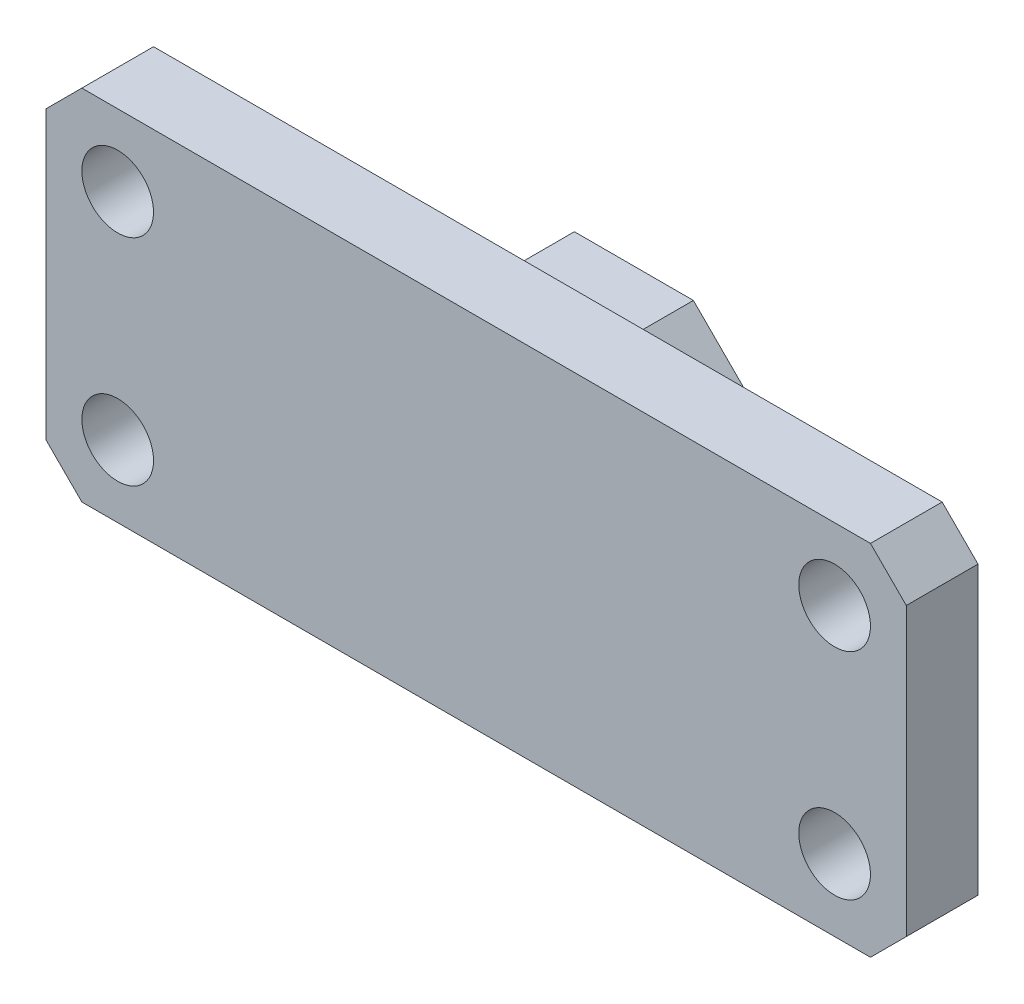
ISO-10303-21;
HEADER;
FILE_DESCRIPTION(('STEP AP214'),'2;1');
FILE_NAME('part.step','',(''),(''),'','','');
FILE_SCHEMA(('AUTOMOTIVE_DESIGN { 1 0 10303 214 1 1 1 1 }'));
ENDSEC;
DATA;
#1=APPLICATION_CONTEXT('core data for automotive mechanical design processes');
#2=APPLICATION_PROTOCOL_DEFINITION('international standard','automotive_design',2000,#1);
#3=PRODUCT_CONTEXT('',#1,'mechanical');
#4=PRODUCT('Part','Part','',(#3));
#5=PRODUCT_RELATED_PRODUCT_CATEGORY('part','',(#4));
#6=PRODUCT_DEFINITION_FORMATION('','',#4);
#7=PRODUCT_DEFINITION_CONTEXT('part definition',#1,'design');
#8=PRODUCT_DEFINITION('design','',#6,#7);
#9=PRODUCT_DEFINITION_SHAPE('','',#8);
#10=(LENGTH_UNIT() NAMED_UNIT(*) SI_UNIT(.MILLI.,.METRE.));
#11=(NAMED_UNIT(*) PLANE_ANGLE_UNIT() SI_UNIT($,.RADIAN.));
#12=(NAMED_UNIT(*) SI_UNIT($,.STERADIAN.) SOLID_ANGLE_UNIT());
#13=UNCERTAINTY_MEASURE_WITH_UNIT(LENGTH_MEASURE(1.E-05),#10,'distance_accuracy_value','');
#14=(GEOMETRIC_REPRESENTATION_CONTEXT(3) GLOBAL_UNCERTAINTY_ASSIGNED_CONTEXT((#13)) GLOBAL_UNIT_ASSIGNED_CONTEXT((#10,
#11,#12)) REPRESENTATION_CONTEXT('',''));
#15=CARTESIAN_POINT('',(0.,0.,0.));
#16=DIRECTION('',(0.,0.,1.));
#17=DIRECTION('',(1.,0.,0.));
#18=AXIS2_PLACEMENT_3D('',#15,#16,#17);
#19=CARTESIAN_POINT('',(0.,0.,10.));
#20=DIRECTION('',(0.,0.,1.));
#21=DIRECTION('',(1.,0.,0.));
#22=AXIS2_PLACEMENT_3D('',#19,#20,#21);
#23=PLANE('',#22);
#24=CARTESIAN_POINT('',(-50.,15.,10.));
#25=DIRECTION('',(0.,0.,-1.));
#26=DIRECTION('',(-1.,0.,0.));
#27=AXIS2_PLACEMENT_3D('',#24,#25,#26);
#28=CIRCLE('',#27,5.);
#29=CARTESIAN_POINT('',(-55.,15.,10.));
#30=VERTEX_POINT('',#29);
#31=EDGE_CURVE('E255',#30,#30,#28,.T.);
#32=ORIENTED_EDGE('',*,*,#31,.T.);
#33=EDGE_LOOP('',(#32));
#34=FACE_BOUND('',#33,.T.);
#35=CARTESIAN_POINT('',(50.,15.,10.));
#36=DIRECTION('',(0.,0.,1.));
#37=DIRECTION('',(1.,0.,0.));
#38=AXIS2_PLACEMENT_3D('',#35,#36,#37);
#39=CIRCLE('',#38,5.);
#40=CARTESIAN_POINT('',(55.,15.,10.));
#41=VERTEX_POINT('',#40);
#42=EDGE_CURVE('E258',#41,#41,#39,.T.);
#43=ORIENTED_EDGE('',*,*,#42,.F.);
#44=EDGE_LOOP('',(#43));
#45=FACE_BOUND('',#44,.T.);
#46=DIRECTION('',(1.,0.,0.));
#47=VECTOR('',#46,1.);
#48=CARTESIAN_POINT('',(-60.,25.,10.));
#49=LINE('',#48,#47);
#50=CARTESIAN_POINT('',(-55.,25.,10.));
#51=VERTEX_POINT('',#50);
#52=CARTESIAN_POINT('',(55.,25.,10.));
#53=VERTEX_POINT('',#52);
#54=EDGE_CURVE('E287',#51,#53,#49,.T.);
#55=ORIENTED_EDGE('',*,*,#54,.F.);
#56=DIRECTION('',(-0.707106781186549,-0.707106781186547,0.));
#57=VECTOR('',#56,1.);
#58=CARTESIAN_POINT('',(-39.9999999999999,40.,10.));
#59=LINE('',#58,#57);
#60=CARTESIAN_POINT('',(-60.,20.,10.));
#61=VERTEX_POINT('',#60);
#62=EDGE_CURVE('E323',#51,#61,#59,.T.);
#63=ORIENTED_EDGE('',*,*,#62,.T.);
#64=DIRECTION('',(0.,-1.,0.));
#65=VECTOR('',#64,1.);
#66=CARTESIAN_POINT('',(-60.,25.,10.));
#67=LINE('',#66,#65);
#68=CARTESIAN_POINT('',(-60.,-20.,10.));
#69=VERTEX_POINT('',#68);
#70=EDGE_CURVE('E279',#61,#69,#67,.T.);
#71=ORIENTED_EDGE('',*,*,#70,.T.);
#72=DIRECTION('',(-0.707106781186547,0.707106781186549,0.));
#73=VECTOR('',#72,1.);
#74=CARTESIAN_POINT('',(-40.0000000000001,-40.,10.));
#75=LINE('',#74,#73);
#76=CARTESIAN_POINT('',(-55.,-25.,10.));
#77=VERTEX_POINT('',#76);
#78=EDGE_CURVE('E321',#69,#77,#75,.F.);
#79=ORIENTED_EDGE('',*,*,#78,.T.);
#80=DIRECTION('',(1.,0.,0.));
#81=VECTOR('',#80,1.);
#82=CARTESIAN_POINT('',(-60.,-25.,10.));
#83=LINE('',#82,#81);
#84=CARTESIAN_POINT('',(55.,-25.,10.));
#85=VERTEX_POINT('',#84);
#86=EDGE_CURVE('E282',#77,#85,#83,.T.);
#87=ORIENTED_EDGE('',*,*,#86,.T.);
#88=DIRECTION('',(0.707106781186549,0.707106781186547,0.));
#89=VECTOR('',#88,1.);
#90=CARTESIAN_POINT('',(39.9999999999999,-40.,10.));
#91=LINE('',#90,#89);
#92=CARTESIAN_POINT('',(60.,-20.,10.));
#93=VERTEX_POINT('',#92);
#94=EDGE_CURVE('E65',#85,#93,#91,.T.);
#95=ORIENTED_EDGE('',*,*,#94,.T.);
#96=DIRECTION('',(0.,-1.,0.));
#97=VECTOR('',#96,1.);
#98=CARTESIAN_POINT('',(60.,25.,10.));
#99=LINE('',#98,#97);
#100=CARTESIAN_POINT('',(60.,20.,10.));
#101=VERTEX_POINT('',#100);
#102=EDGE_CURVE('E285',#101,#93,#99,.T.);
#103=ORIENTED_EDGE('',*,*,#102,.F.);
#104=DIRECTION('',(0.707106781186547,-0.707106781186549,0.));
#105=VECTOR('',#104,1.);
#106=CARTESIAN_POINT('',(40.0000000000001,40.,10.));
#107=LINE('',#106,#105);
#108=EDGE_CURVE('E318',#101,#53,#107,.F.);
#109=ORIENTED_EDGE('',*,*,#108,.T.);
#110=EDGE_LOOP('',(#55,#63,#71,#79,#87,#95,#103,#109));
#111=FACE_BOUND('',#110,.T.);
#112=CARTESIAN_POINT('',(-50.,-15.,10.));
#113=DIRECTION('',(0.,0.,1.));
#114=DIRECTION('',(1.,0.,0.));
#115=AXIS2_PLACEMENT_3D('',#112,#113,#114);
#116=CIRCLE('',#115,5.);
#117=CARTESIAN_POINT('',(-45.,-15.,10.));
#118=VERTEX_POINT('',#117);
#119=EDGE_CURVE('E262',#118,#118,#116,.T.);
#120=ORIENTED_EDGE('',*,*,#119,.F.);
#121=EDGE_LOOP('',(#120));
#122=FACE_BOUND('',#121,.T.);
#123=CARTESIAN_POINT('',(50.,-15.,10.));
#124=DIRECTION('',(0.,0.,-1.));
#125=DIRECTION('',(-1.,0.,0.));
#126=AXIS2_PLACEMENT_3D('',#123,#124,#125);
#127=CIRCLE('',#126,5.);
#128=CARTESIAN_POINT('',(45.,-15.,10.));
#129=VERTEX_POINT('',#128);
#130=EDGE_CURVE('E268',#129,#129,#127,.T.);
#131=ORIENTED_EDGE('',*,*,#130,.T.);
#132=EDGE_LOOP('',(#131));
#133=FACE_BOUND('',#132,.T.);
#134=ADVANCED_FACE('F41',(#34,#45,#111,#122,#133),#23,.T.);
#135=CARTESIAN_POINT('',(0.,0.,0.));
#136=DIRECTION('',(0.,0.,1.));
#137=DIRECTION('',(1.,0.,0.));
#138=AXIS2_PLACEMENT_3D('',#135,#136,#137);
#139=PLANE('',#138);
#140=DIRECTION('',(0.,1.,0.));
#141=VECTOR('',#140,1.);
#142=CARTESIAN_POINT('',(35.,0.,0.));
#143=LINE('',#142,#141);
#144=CARTESIAN_POINT('',(35.,-8.29999999999997,0.));
#145=VERTEX_POINT('',#144);
#146=CARTESIAN_POINT('',(35.,8.3,0.));
#147=VERTEX_POINT('',#146);
#148=EDGE_CURVE('E50',#145,#147,#143,.T.);
#149=ORIENTED_EDGE('',*,*,#148,.T.);
#150=DIRECTION('',(-1.,0.,0.));
#151=VECTOR('',#150,1.);
#152=CARTESIAN_POINT('',(0.,8.3,0.));
#153=LINE('',#152,#151);
#154=CARTESIAN_POINT('',(20.,8.3,0.));
#155=VERTEX_POINT('',#154);
#156=EDGE_CURVE('E11',#147,#155,#153,.T.);
#157=ORIENTED_EDGE('',*,*,#156,.T.);
#158=DIRECTION('',(-0.707106781186548,0.707106781186548,0.));
#159=VECTOR('',#158,1.);
#160=CARTESIAN_POINT('',(14.15,14.15,0.));
#161=LINE('',#160,#159);
#162=CARTESIAN_POINT('',(8.3,20.,0.));
#163=VERTEX_POINT('',#162);
#164=EDGE_CURVE('E185',#155,#163,#161,.T.);
#165=ORIENTED_EDGE('',*,*,#164,.T.);
#166=DIRECTION('',(1.,0.,0.));
#167=VECTOR('',#166,1.);
#168=CARTESIAN_POINT('',(0.,20.,0.));
#169=LINE('',#168,#167);
#170=CARTESIAN_POINT('',(-8.3,20.,0.));
#171=VERTEX_POINT('',#170);
#172=EDGE_CURVE('E336',#171,#163,#169,.T.);
#173=ORIENTED_EDGE('',*,*,#172,.F.);
#174=DIRECTION('',(0.707106781186548,0.707106781186548,0.));
#175=VECTOR('',#174,1.);
#176=CARTESIAN_POINT('',(-14.15,14.15,0.));
#177=LINE('',#176,#175);
#178=CARTESIAN_POINT('',(-20.,8.3,0.));
#179=VERTEX_POINT('',#178);
#180=EDGE_CURVE('E338',#179,#171,#177,.T.);
#181=ORIENTED_EDGE('',*,*,#180,.F.);
#182=DIRECTION('',(1.,0.,0.));
#183=VECTOR('',#182,1.);
#184=CARTESIAN_POINT('',(0.,8.3,0.));
#185=LINE('',#184,#183);
#186=CARTESIAN_POINT('',(-35.,8.3,0.));
#187=VERTEX_POINT('',#186);
#188=EDGE_CURVE('E340',#187,#179,#185,.T.);
#189=ORIENTED_EDGE('',*,*,#188,.F.);
#190=DIRECTION('',(0.,1.,0.));
#191=VECTOR('',#190,1.);
#192=CARTESIAN_POINT('',(-35.,0.,0.));
#193=LINE('',#192,#191);
#194=CARTESIAN_POINT('',(-35.,-8.29999999999999,0.));
#195=VERTEX_POINT('',#194);
#196=EDGE_CURVE('E342',#195,#187,#193,.T.);
#197=ORIENTED_EDGE('',*,*,#196,.F.);
#198=DIRECTION('',(1.,0.,0.));
#199=VECTOR('',#198,1.);
#200=CARTESIAN_POINT('',(0.,-8.29999999999998,0.));
#201=LINE('',#200,#199);
#202=CARTESIAN_POINT('',(-20.,-8.29999999999999,0.));
#203=VERTEX_POINT('',#202);
#204=EDGE_CURVE('E344',#195,#203,#201,.T.);
#205=ORIENTED_EDGE('',*,*,#204,.T.);
#206=DIRECTION('',(0.707106781186548,-0.707106781186547,0.));
#207=VECTOR('',#206,1.);
#208=CARTESIAN_POINT('',(-14.15,-14.15,0.));
#209=LINE('',#208,#207);
#210=CARTESIAN_POINT('',(-8.3,-20.,0.));
#211=VERTEX_POINT('',#210);
#212=EDGE_CURVE('E347',#203,#211,#209,.T.);
#213=ORIENTED_EDGE('',*,*,#212,.T.);
#214=DIRECTION('',(1.,0.,0.));
#215=VECTOR('',#214,1.);
#216=CARTESIAN_POINT('',(0.,-20.,0.));
#217=LINE('',#216,#215);
#218=CARTESIAN_POINT('',(8.3,-20.,0.));
#219=VERTEX_POINT('',#218);
#220=EDGE_CURVE('E350',#211,#219,#217,.T.);
#221=ORIENTED_EDGE('',*,*,#220,.T.);
#222=DIRECTION('',(-0.707106781186547,-0.707106781186548,0.));
#223=VECTOR('',#222,1.);
#224=CARTESIAN_POINT('',(14.15,-14.15,0.));
#225=LINE('',#224,#223);
#226=CARTESIAN_POINT('',(20.,-8.29999999999998,0.));
#227=VERTEX_POINT('',#226);
#228=EDGE_CURVE('E353',#227,#219,#225,.T.);
#229=ORIENTED_EDGE('',*,*,#228,.F.);
#230=DIRECTION('',(-1.,0.,0.));
#231=VECTOR('',#230,1.);
#232=CARTESIAN_POINT('',(0.,-8.29999999999998,0.));
#233=LINE('',#232,#231);
#234=EDGE_CURVE('E355',#145,#227,#233,.T.);
#235=ORIENTED_EDGE('',*,*,#234,.F.);
#236=EDGE_LOOP('',(#149,#157,#165,#173,#181,#189,#197,#205,#213,#221,#229,#235));
#237=FACE_BOUND('',#236,.T.);
#238=CARTESIAN_POINT('',(-50.,-15.,0.));
#239=DIRECTION('',(0.,0.,1.));
#240=DIRECTION('',(1.,0.,0.));
#241=AXIS2_PLACEMENT_3D('',#238,#239,#240);
#242=CIRCLE('',#241,5.);
#243=CARTESIAN_POINT('',(-45.,-15.,0.));
#244=VERTEX_POINT('',#243);
#245=EDGE_CURVE('E265',#244,#244,#242,.T.);
#246=ORIENTED_EDGE('',*,*,#245,.T.);
#247=EDGE_LOOP('',(#246));
#248=FACE_BOUND('',#247,.T.);
#249=CARTESIAN_POINT('',(50.,15.,0.));
#250=DIRECTION('',(0.,0.,1.));
#251=DIRECTION('',(1.,0.,0.));
#252=AXIS2_PLACEMENT_3D('',#249,#250,#251);
#253=CIRCLE('',#252,5.);
#254=CARTESIAN_POINT('',(55.,15.,0.));
#255=VERTEX_POINT('',#254);
#256=EDGE_CURVE('E273',#255,#255,#253,.T.);
#257=ORIENTED_EDGE('',*,*,#256,.T.);
#258=EDGE_LOOP('',(#257));
#259=FACE_BOUND('',#258,.T.);
#260=DIRECTION('',(0.,-1.,0.));
#261=VECTOR('',#260,1.);
#262=CARTESIAN_POINT('',(-60.,25.,0.));
#263=LINE('',#262,#261);
#264=CARTESIAN_POINT('',(-60.,20.,0.));
#265=VERTEX_POINT('',#264);
#266=CARTESIAN_POINT('',(-60.,-20.,0.));
#267=VERTEX_POINT('',#266);
#268=EDGE_CURVE('E276',#265,#267,#263,.T.);
#269=ORIENTED_EDGE('',*,*,#268,.F.);
#270=DIRECTION('',(0.707106781186549,0.707106781186547,0.));
#271=VECTOR('',#270,1.);
#272=CARTESIAN_POINT('',(-60.,20.,0.));
#273=LINE('',#272,#271);
#274=CARTESIAN_POINT('',(-55.,25.,0.));
#275=VERTEX_POINT('',#274);
#276=EDGE_CURVE('E311',#265,#275,#273,.T.);
#277=ORIENTED_EDGE('',*,*,#276,.T.);
#278=DIRECTION('',(1.,0.,0.));
#279=VECTOR('',#278,1.);
#280=CARTESIAN_POINT('',(-60.,25.,0.));
#281=LINE('',#280,#279);
#282=CARTESIAN_POINT('',(55.,25.,0.));
#283=VERTEX_POINT('',#282);
#284=EDGE_CURVE('E283',#275,#283,#281,.T.);
#285=ORIENTED_EDGE('',*,*,#284,.T.);
#286=DIRECTION('',(-0.707106781186547,0.707106781186549,0.));
#287=VECTOR('',#286,1.);
#288=CARTESIAN_POINT('',(55.,25.,0.));
#289=LINE('',#288,#287);
#290=CARTESIAN_POINT('',(60.,20.,0.));
#291=VERTEX_POINT('',#290);
#292=EDGE_CURVE('E305',#283,#291,#289,.F.);
#293=ORIENTED_EDGE('',*,*,#292,.T.);
#294=DIRECTION('',(0.,-1.,0.));
#295=VECTOR('',#294,1.);
#296=CARTESIAN_POINT('',(60.,25.,0.));
#297=LINE('',#296,#295);
#298=CARTESIAN_POINT('',(60.,-20.,0.));
#299=VERTEX_POINT('',#298);
#300=EDGE_CURVE('E296',#291,#299,#297,.T.);
#301=ORIENTED_EDGE('',*,*,#300,.T.);
#302=DIRECTION('',(-0.707106781186549,-0.707106781186547,0.));
#303=VECTOR('',#302,1.);
#304=CARTESIAN_POINT('',(60.,-20.,0.));
#305=LINE('',#304,#303);
#306=CARTESIAN_POINT('',(55.,-25.,0.));
#307=VERTEX_POINT('',#306);
#308=EDGE_CURVE('E307',#299,#307,#305,.T.);
#309=ORIENTED_EDGE('',*,*,#308,.T.);
#310=DIRECTION('',(1.,0.,0.));
#311=VECTOR('',#310,1.);
#312=CARTESIAN_POINT('',(-60.,-25.,0.));
#313=LINE('',#312,#311);
#314=CARTESIAN_POINT('',(-55.,-25.,0.));
#315=VERTEX_POINT('',#314);
#316=EDGE_CURVE('E293',#315,#307,#313,.T.);
#317=ORIENTED_EDGE('',*,*,#316,.F.);
#318=DIRECTION('',(0.707106781186547,-0.707106781186549,0.));
#319=VECTOR('',#318,1.);
#320=CARTESIAN_POINT('',(-55.,-25.,0.));
#321=LINE('',#320,#319);
#322=EDGE_CURVE('E309',#315,#267,#321,.F.);
#323=ORIENTED_EDGE('',*,*,#322,.T.);
#324=EDGE_LOOP('',(#269,#277,#285,#293,#301,#309,#317,#323));
#325=FACE_BOUND('',#324,.T.);
#326=CARTESIAN_POINT('',(-50.,15.,0.));
#327=DIRECTION('',(0.,0.,-1.));
#328=DIRECTION('',(-1.,0.,0.));
#329=AXIS2_PLACEMENT_3D('',#326,#327,#328);
#330=CIRCLE('',#329,5.);
#331=CARTESIAN_POINT('',(-55.,15.,0.));
#332=VERTEX_POINT('',#331);
#333=EDGE_CURVE('E259',#332,#332,#330,.T.);
#334=ORIENTED_EDGE('',*,*,#333,.F.);
#335=EDGE_LOOP('',(#334));
#336=FACE_BOUND('',#335,.T.);
#337=CARTESIAN_POINT('',(50.,-15.,0.));
#338=DIRECTION('',(0.,0.,-1.));
#339=DIRECTION('',(-1.,0.,0.));
#340=AXIS2_PLACEMENT_3D('',#337,#338,#339);
#341=CIRCLE('',#340,5.);
#342=CARTESIAN_POINT('',(45.,-15.,0.));
#343=VERTEX_POINT('',#342);
#344=EDGE_CURVE('E226',#343,#343,#341,.T.);
#345=ORIENTED_EDGE('',*,*,#344,.F.);
#346=EDGE_LOOP('',(#345));
#347=FACE_BOUND('',#346,.T.);
#348=ADVANCED_FACE('F359',(#237,#248,#259,#325,#336,#347),#139,.F.);
#349=CARTESIAN_POINT('',(-60.,25.,10.));
#350=DIRECTION('',(1.,0.,0.));
#351=DIRECTION('',(0.,0.,-1.));
#352=AXIS2_PLACEMENT_3D('',#349,#350,#351);
#353=PLANE('',#352);
#354=ORIENTED_EDGE('',*,*,#70,.F.);
#355=DIRECTION('',(0.,0.,-1.));
#356=VECTOR('',#355,1.);
#357=CARTESIAN_POINT('',(-60.,20.,0.));
#358=LINE('',#357,#356);
#359=EDGE_CURVE('E302',#61,#265,#358,.T.);
#360=ORIENTED_EDGE('',*,*,#359,.T.);
#361=ORIENTED_EDGE('',*,*,#268,.T.);
#362=DIRECTION('',(0.,0.,1.));
#363=VECTOR('',#362,1.);
#364=CARTESIAN_POINT('',(-60.,-20.,10.));
#365=LINE('',#364,#363);
#366=EDGE_CURVE('E290',#267,#69,#365,.T.);
#367=ORIENTED_EDGE('',*,*,#366,.T.);
#368=EDGE_LOOP('',(#354,#360,#361,#367));
#369=FACE_BOUND('',#368,.T.);
#370=ADVANCED_FACE('F413',(#369),#353,.F.);
#371=CARTESIAN_POINT('',(-60.,-25.,10.));
#372=DIRECTION('',(0.,1.,0.));
#373=DIRECTION('',(0.,0.,1.));
#374=AXIS2_PLACEMENT_3D('',#371,#372,#373);
#375=PLANE('',#374);
#376=ORIENTED_EDGE('',*,*,#86,.F.);
#377=DIRECTION('',(0.,0.,-1.));
#378=VECTOR('',#377,1.);
#379=CARTESIAN_POINT('',(-55.,-25.,10.));
#380=LINE('',#379,#378);
#381=EDGE_CURVE('E327',#77,#315,#380,.T.);
#382=ORIENTED_EDGE('',*,*,#381,.T.);
#383=ORIENTED_EDGE('',*,*,#316,.T.);
#384=DIRECTION('',(0.,0.,1.));
#385=VECTOR('',#384,1.);
#386=CARTESIAN_POINT('',(55.,-25.,10.));
#387=LINE('',#386,#385);
#388=EDGE_CURVE('E325',#307,#85,#387,.T.);
#389=ORIENTED_EDGE('',*,*,#388,.T.);
#390=EDGE_LOOP('',(#376,#382,#383,#389));
#391=FACE_BOUND('',#390,.T.);
#392=ADVANCED_FACE('F427',(#391),#375,.F.);
#393=CARTESIAN_POINT('',(60.,25.,10.));
#394=DIRECTION('',(1.,0.,0.));
#395=DIRECTION('',(0.,0.,-1.));
#396=AXIS2_PLACEMENT_3D('',#393,#394,#395);
#397=PLANE('',#396);
#398=ORIENTED_EDGE('',*,*,#102,.T.);
#399=DIRECTION('',(0.,0.,-1.));
#400=VECTOR('',#399,1.);
#401=CARTESIAN_POINT('',(60.,-20.,0.));
#402=LINE('',#401,#400);
#403=EDGE_CURVE('E332',#93,#299,#402,.T.);
#404=ORIENTED_EDGE('',*,*,#403,.T.);
#405=ORIENTED_EDGE('',*,*,#300,.F.);
#406=DIRECTION('',(0.,0.,1.));
#407=VECTOR('',#406,1.);
#408=CARTESIAN_POINT('',(60.,20.,10.));
#409=LINE('',#408,#407);
#410=EDGE_CURVE('E330',#291,#101,#409,.T.);
#411=ORIENTED_EDGE('',*,*,#410,.T.);
#412=EDGE_LOOP('',(#398,#404,#405,#411));
#413=FACE_BOUND('',#412,.T.);
#414=ADVANCED_FACE('F423',(#413),#397,.T.);
#415=CARTESIAN_POINT('',(-60.,25.,10.));
#416=DIRECTION('',(0.,1.,0.));
#417=DIRECTION('',(0.,0.,1.));
#418=AXIS2_PLACEMENT_3D('',#415,#416,#417);
#419=PLANE('',#418);
#420=ORIENTED_EDGE('',*,*,#284,.F.);
#421=DIRECTION('',(0.,0.,1.));
#422=VECTOR('',#421,1.);
#423=CARTESIAN_POINT('',(-55.,25.,10.));
#424=LINE('',#423,#422);
#425=EDGE_CURVE('E316',#275,#51,#424,.T.);
#426=ORIENTED_EDGE('',*,*,#425,.T.);
#427=ORIENTED_EDGE('',*,*,#54,.T.);
#428=DIRECTION('',(0.,0.,-1.));
#429=VECTOR('',#428,1.);
#430=CARTESIAN_POINT('',(55.,25.,10.));
#431=LINE('',#430,#429);
#432=EDGE_CURVE('E313',#53,#283,#431,.T.);
#433=ORIENTED_EDGE('',*,*,#432,.T.);
#434=EDGE_LOOP('',(#420,#426,#427,#433));
#435=FACE_BOUND('',#434,.T.);
#436=ADVANCED_FACE('F420',(#435),#419,.T.);
#437=CARTESIAN_POINT('',(50.,15.,0.));
#438=DIRECTION('',(0.,0.,1.));
#439=DIRECTION('',(1.,0.,0.));
#440=AXIS2_PLACEMENT_3D('',#437,#438,#439);
#441=CYLINDRICAL_SURFACE('',#440,5.);
#442=ORIENTED_EDGE('',*,*,#256,.F.);
#443=EDGE_LOOP('',(#442));
#444=FACE_BOUND('',#443,.T.);
#445=ORIENTED_EDGE('',*,*,#42,.T.);
#446=EDGE_LOOP('',(#445));
#447=FACE_BOUND('',#446,.T.);
#448=ADVANCED_FACE('F417',(#444,#447),#441,.F.);
#449=CARTESIAN_POINT('',(-50.,15.,0.));
#450=DIRECTION('',(0.,0.,1.));
#451=DIRECTION('',(1.,0.,0.));
#452=AXIS2_PLACEMENT_3D('',#449,#450,#451);
#453=CYLINDRICAL_SURFACE('',#452,5.);
#454=ORIENTED_EDGE('',*,*,#333,.T.);
#455=EDGE_LOOP('',(#454));
#456=FACE_BOUND('',#455,.T.);
#457=ORIENTED_EDGE('',*,*,#31,.F.);
#458=EDGE_LOOP('',(#457));
#459=FACE_BOUND('',#458,.T.);
#460=ADVANCED_FACE('F490',(#456,#459),#453,.F.);
#461=CARTESIAN_POINT('',(-50.,-15.,0.));
#462=DIRECTION('',(0.,0.,1.));
#463=DIRECTION('',(1.,0.,0.));
#464=AXIS2_PLACEMENT_3D('',#461,#462,#463);
#465=CYLINDRICAL_SURFACE('',#464,5.);
#466=ORIENTED_EDGE('',*,*,#245,.F.);
#467=EDGE_LOOP('',(#466));
#468=FACE_BOUND('',#467,.T.);
#469=ORIENTED_EDGE('',*,*,#119,.T.);
#470=EDGE_LOOP('',(#469));
#471=FACE_BOUND('',#470,.T.);
#472=ADVANCED_FACE('F485',(#468,#471),#465,.F.);
#473=CARTESIAN_POINT('',(50.,-15.,0.));
#474=DIRECTION('',(0.,0.,1.));
#475=DIRECTION('',(1.,0.,0.));
#476=AXIS2_PLACEMENT_3D('',#473,#474,#475);
#477=CYLINDRICAL_SURFACE('',#476,5.);
#478=ORIENTED_EDGE('',*,*,#344,.T.);
#479=EDGE_LOOP('',(#478));
#480=FACE_BOUND('',#479,.T.);
#481=ORIENTED_EDGE('',*,*,#130,.F.);
#482=EDGE_LOOP('',(#481));
#483=FACE_BOUND('',#482,.T.);
#484=ADVANCED_FACE('F443',(#480,#483),#477,.F.);
#485=CARTESIAN_POINT('',(-60.,20.,10.));
#486=DIRECTION('',(-0.707106781186546,0.707106781186548,0.));
#487=DIRECTION('',(0.,0.,1.));
#488=AXIS2_PLACEMENT_3D('',#485,#486,#487);
#489=PLANE('',#488);
#490=ORIENTED_EDGE('',*,*,#62,.F.);
#491=ORIENTED_EDGE('',*,*,#425,.F.);
#492=ORIENTED_EDGE('',*,*,#276,.F.);
#493=ORIENTED_EDGE('',*,*,#359,.F.);
#494=EDGE_LOOP('',(#490,#491,#492,#493));
#495=FACE_BOUND('',#494,.T.);
#496=ADVANCED_FACE('F436',(#495),#489,.T.);
#497=CARTESIAN_POINT('',(-55.,-25.,10.));
#498=DIRECTION('',(0.707106781186548,0.707106781186546,0.));
#499=DIRECTION('',(0.,0.,-1.));
#500=AXIS2_PLACEMENT_3D('',#497,#498,#499);
#501=PLANE('',#500);
#502=ORIENTED_EDGE('',*,*,#78,.F.);
#503=ORIENTED_EDGE('',*,*,#366,.F.);
#504=ORIENTED_EDGE('',*,*,#322,.F.);
#505=ORIENTED_EDGE('',*,*,#381,.F.);
#506=EDGE_LOOP('',(#502,#503,#504,#505));
#507=FACE_BOUND('',#506,.T.);
#508=ADVANCED_FACE('F442',(#507),#501,.F.);
#509=CARTESIAN_POINT('',(60.,-20.,10.));
#510=DIRECTION('',(0.707106781186546,-0.707106781186548,0.));
#511=DIRECTION('',(0.,0.,1.));
#512=AXIS2_PLACEMENT_3D('',#509,#510,#511);
#513=PLANE('',#512);
#514=ORIENTED_EDGE('',*,*,#94,.F.);
#515=ORIENTED_EDGE('',*,*,#388,.F.);
#516=ORIENTED_EDGE('',*,*,#308,.F.);
#517=ORIENTED_EDGE('',*,*,#403,.F.);
#518=EDGE_LOOP('',(#514,#515,#516,#517));
#519=FACE_BOUND('',#518,.T.);
#520=ADVANCED_FACE('F449',(#519),#513,.T.);
#521=CARTESIAN_POINT('',(55.,25.,10.));
#522=DIRECTION('',(-0.707106781186548,-0.707106781186546,0.));
#523=DIRECTION('',(0.,0.,-1.));
#524=AXIS2_PLACEMENT_3D('',#521,#522,#523);
#525=PLANE('',#524);
#526=ORIENTED_EDGE('',*,*,#108,.F.);
#527=ORIENTED_EDGE('',*,*,#410,.F.);
#528=ORIENTED_EDGE('',*,*,#292,.F.);
#529=ORIENTED_EDGE('',*,*,#432,.F.);
#530=EDGE_LOOP('',(#526,#527,#528,#529));
#531=FACE_BOUND('',#530,.T.);
#532=ADVANCED_FACE('F44',(#531),#525,.F.);
#533=CARTESIAN_POINT('',(0.,8.3,-12.));
#534=DIRECTION('',(0.,1.,0.));
#535=DIRECTION('',(0.,0.,1.));
#536=AXIS2_PLACEMENT_3D('',#533,#534,#535);
#537=PLANE('',#536);
#538=ORIENTED_EDGE('',*,*,#156,.F.);
#539=DIRECTION('',(0.,0.,1.));
#540=VECTOR('',#539,1.);
#541=CARTESIAN_POINT('',(35.,8.3,-12.));
#542=LINE('',#541,#540);
#543=CARTESIAN_POINT('',(35.,8.3,-12.));
#544=VERTEX_POINT('',#543);
#545=EDGE_CURVE('E201',#544,#147,#542,.T.);
#546=ORIENTED_EDGE('',*,*,#545,.F.);
#547=DIRECTION('',(-1.,0.,0.));
#548=VECTOR('',#547,1.);
#549=CARTESIAN_POINT('',(0.,8.3,-12.));
#550=LINE('',#549,#548);
#551=CARTESIAN_POINT('',(20.,8.3,-12.));
#552=VERTEX_POINT('',#551);
#553=EDGE_CURVE('E194',#544,#552,#550,.T.);
#554=ORIENTED_EDGE('',*,*,#553,.T.);
#555=DIRECTION('',(0.,0.,1.));
#556=VECTOR('',#555,1.);
#557=CARTESIAN_POINT('',(20.,8.3,-12.));
#558=LINE('',#557,#556);
#559=EDGE_CURVE('E180',#552,#155,#558,.T.);
#560=ORIENTED_EDGE('',*,*,#559,.T.);
#561=EDGE_LOOP('',(#538,#546,#554,#560));
#562=FACE_BOUND('',#561,.T.);
#563=ADVANCED_FACE('F199',(#562),#537,.T.);
#564=CARTESIAN_POINT('',(35.,0.,-12.));
#565=DIRECTION('',(1.,0.,0.));
#566=DIRECTION('',(0.,0.,-1.));
#567=AXIS2_PLACEMENT_3D('',#564,#565,#566);
#568=PLANE('',#567);
#569=ORIENTED_EDGE('',*,*,#148,.F.);
#570=DIRECTION('',(0.,0.,1.));
#571=VECTOR('',#570,1.);
#572=CARTESIAN_POINT('',(35.,-8.29999999999997,-12.));
#573=LINE('',#572,#571);
#574=CARTESIAN_POINT('',(35.,-8.29999999999997,-12.));
#575=VERTEX_POINT('',#574);
#576=EDGE_CURVE('E227',#575,#145,#573,.T.);
#577=ORIENTED_EDGE('',*,*,#576,.F.);
#578=DIRECTION('',(0.,1.,0.));
#579=VECTOR('',#578,1.);
#580=CARTESIAN_POINT('',(35.,0.,-12.));
#581=LINE('',#580,#579);
#582=EDGE_CURVE('E188',#575,#544,#581,.T.);
#583=ORIENTED_EDGE('',*,*,#582,.T.);
#584=ORIENTED_EDGE('',*,*,#545,.T.);
#585=EDGE_LOOP('',(#569,#577,#583,#584));
#586=FACE_BOUND('',#585,.T.);
#587=ADVANCED_FACE('F363',(#586),#568,.T.);
#588=CARTESIAN_POINT('',(0.,-8.29999999999998,-12.));
#589=DIRECTION('',(0.,1.,0.));
#590=DIRECTION('',(-1.,0.,0.));
#591=AXIS2_PLACEMENT_3D('',#588,#589,#590);
#592=PLANE('',#591);
#593=ORIENTED_EDGE('',*,*,#576,.T.);
#594=ORIENTED_EDGE('',*,*,#234,.T.);
#595=DIRECTION('',(0.,0.,1.));
#596=VECTOR('',#595,1.);
#597=CARTESIAN_POINT('',(20.,-8.29999999999998,-12.));
#598=LINE('',#597,#596);
#599=CARTESIAN_POINT('',(20.,-8.29999999999998,-12.));
#600=VERTEX_POINT('',#599);
#601=EDGE_CURVE('E230',#600,#227,#598,.T.);
#602=ORIENTED_EDGE('',*,*,#601,.F.);
#603=DIRECTION('',(-1.,0.,0.));
#604=VECTOR('',#603,1.);
#605=CARTESIAN_POINT('',(0.,-8.29999999999998,-12.));
#606=LINE('',#605,#604);
#607=EDGE_CURVE('E222',#575,#600,#606,.T.);
#608=ORIENTED_EDGE('',*,*,#607,.F.);
#609=EDGE_LOOP('',(#593,#594,#602,#608));
#610=FACE_BOUND('',#609,.T.);
#611=ADVANCED_FACE('F366',(#610),#592,.F.);
#612=CARTESIAN_POINT('',(14.15,-14.15,-12.));
#613=DIRECTION('',(-0.707106781186548,0.707106781186547,0.));
#614=DIRECTION('',(-0.707106781186547,-0.707106781186548,0.));
#615=AXIS2_PLACEMENT_3D('',#612,#613,#614);
#616=PLANE('',#615);
#617=ORIENTED_EDGE('',*,*,#601,.T.);
#618=ORIENTED_EDGE('',*,*,#228,.T.);
#619=DIRECTION('',(0.,0.,1.));
#620=VECTOR('',#619,1.);
#621=CARTESIAN_POINT('',(8.3,-20.,-12.));
#622=LINE('',#621,#620);
#623=CARTESIAN_POINT('',(8.3,-20.,-12.));
#624=VERTEX_POINT('',#623);
#625=EDGE_CURVE('E233',#624,#219,#622,.T.);
#626=ORIENTED_EDGE('',*,*,#625,.F.);
#627=DIRECTION('',(-0.707106781186547,-0.707106781186548,0.));
#628=VECTOR('',#627,1.);
#629=CARTESIAN_POINT('',(14.15,-14.15,-12.));
#630=LINE('',#629,#628);
#631=EDGE_CURVE('E220',#600,#624,#630,.T.);
#632=ORIENTED_EDGE('',*,*,#631,.F.);
#633=EDGE_LOOP('',(#617,#618,#626,#632));
#634=FACE_BOUND('',#633,.T.);
#635=ADVANCED_FACE('F373',(#634),#616,.F.);
#636=CARTESIAN_POINT('',(0.,-20.,-12.));
#637=DIRECTION('',(0.,-1.,0.));
#638=DIRECTION('',(0.,0.,-1.));
#639=AXIS2_PLACEMENT_3D('',#636,#637,#638);
#640=PLANE('',#639);
#641=ORIENTED_EDGE('',*,*,#220,.F.);
#642=DIRECTION('',(0.,0.,1.));
#643=VECTOR('',#642,1.);
#644=CARTESIAN_POINT('',(-8.3,-20.,-12.));
#645=LINE('',#644,#643);
#646=CARTESIAN_POINT('',(-8.3,-20.,-12.));
#647=VERTEX_POINT('',#646);
#648=EDGE_CURVE('E236',#647,#211,#645,.T.);
#649=ORIENTED_EDGE('',*,*,#648,.F.);
#650=DIRECTION('',(1.,0.,0.));
#651=VECTOR('',#650,1.);
#652=CARTESIAN_POINT('',(0.,-20.,-12.));
#653=LINE('',#652,#651);
#654=EDGE_CURVE('E217',#647,#624,#653,.T.);
#655=ORIENTED_EDGE('',*,*,#654,.T.);
#656=ORIENTED_EDGE('',*,*,#625,.T.);
#657=EDGE_LOOP('',(#641,#649,#655,#656));
#658=FACE_BOUND('',#657,.T.);
#659=ADVANCED_FACE('F375',(#658),#640,.T.);
#660=CARTESIAN_POINT('',(-14.15,-14.15,-12.));
#661=DIRECTION('',(-0.707106781186547,-0.707106781186548,0.));
#662=DIRECTION('',(0.707106781186548,-0.707106781186547,0.));
#663=AXIS2_PLACEMENT_3D('',#660,#661,#662);
#664=PLANE('',#663);
#665=ORIENTED_EDGE('',*,*,#212,.F.);
#666=DIRECTION('',(0.,0.,1.));
#667=VECTOR('',#666,1.);
#668=CARTESIAN_POINT('',(-20.,-8.29999999999999,-12.));
#669=LINE('',#668,#667);
#670=CARTESIAN_POINT('',(-20.,-8.29999999999999,-12.));
#671=VERTEX_POINT('',#670);
#672=EDGE_CURVE('E239',#671,#203,#669,.T.);
#673=ORIENTED_EDGE('',*,*,#672,.F.);
#674=DIRECTION('',(0.707106781186548,-0.707106781186547,0.));
#675=VECTOR('',#674,1.);
#676=CARTESIAN_POINT('',(-14.15,-14.15,-12.));
#677=LINE('',#676,#675);
#678=EDGE_CURVE('E214',#671,#647,#677,.T.);
#679=ORIENTED_EDGE('',*,*,#678,.T.);
#680=ORIENTED_EDGE('',*,*,#648,.T.);
#681=EDGE_LOOP('',(#665,#673,#679,#680));
#682=FACE_BOUND('',#681,.T.);
#683=ADVANCED_FACE('F377',(#682),#664,.T.);
#684=CARTESIAN_POINT('',(0.,-8.29999999999998,-12.));
#685=DIRECTION('',(0.,-1.,0.));
#686=DIRECTION('',(1.,0.,0.));
#687=AXIS2_PLACEMENT_3D('',#684,#685,#686);
#688=PLANE('',#687);
#689=ORIENTED_EDGE('',*,*,#204,.F.);
#690=DIRECTION('',(0.,0.,1.));
#691=VECTOR('',#690,1.);
#692=CARTESIAN_POINT('',(-35.,-8.29999999999999,-12.));
#693=LINE('',#692,#691);
#694=CARTESIAN_POINT('',(-35.,-8.29999999999999,-12.));
#695=VERTEX_POINT('',#694);
#696=EDGE_CURVE('E242',#695,#195,#693,.T.);
#697=ORIENTED_EDGE('',*,*,#696,.F.);
#698=DIRECTION('',(1.,0.,0.));
#699=VECTOR('',#698,1.);
#700=CARTESIAN_POINT('',(0.,-8.29999999999998,-12.));
#701=LINE('',#700,#699);
#702=EDGE_CURVE('E211',#695,#671,#701,.T.);
#703=ORIENTED_EDGE('',*,*,#702,.T.);
#704=ORIENTED_EDGE('',*,*,#672,.T.);
#705=EDGE_LOOP('',(#689,#697,#703,#704));
#706=FACE_BOUND('',#705,.T.);
#707=ADVANCED_FACE('F381',(#706),#688,.T.);
#708=CARTESIAN_POINT('',(-35.,0.,-12.));
#709=DIRECTION('',(1.,0.,0.));
#710=DIRECTION('',(0.,0.,-1.));
#711=AXIS2_PLACEMENT_3D('',#708,#709,#710);
#712=PLANE('',#711);
#713=ORIENTED_EDGE('',*,*,#696,.T.);
#714=ORIENTED_EDGE('',*,*,#196,.T.);
#715=DIRECTION('',(0.,0.,1.));
#716=VECTOR('',#715,1.);
#717=CARTESIAN_POINT('',(-35.,8.3,-12.));
#718=LINE('',#717,#716);
#719=CARTESIAN_POINT('',(-35.,8.3,-12.));
#720=VERTEX_POINT('',#719);
#721=EDGE_CURVE('E245',#720,#187,#718,.T.);
#722=ORIENTED_EDGE('',*,*,#721,.F.);
#723=DIRECTION('',(0.,1.,0.));
#724=VECTOR('',#723,1.);
#725=CARTESIAN_POINT('',(-35.,0.,-12.));
#726=LINE('',#725,#724);
#727=EDGE_CURVE('E209',#695,#720,#726,.T.);
#728=ORIENTED_EDGE('',*,*,#727,.F.);
#729=EDGE_LOOP('',(#713,#714,#722,#728));
#730=FACE_BOUND('',#729,.T.);
#731=ADVANCED_FACE('F384',(#730),#712,.F.);
#732=CARTESIAN_POINT('',(0.,8.3,-12.));
#733=DIRECTION('',(0.,-1.,0.));
#734=DIRECTION('',(0.,0.,-1.));
#735=AXIS2_PLACEMENT_3D('',#732,#733,#734);
#736=PLANE('',#735);
#737=ORIENTED_EDGE('',*,*,#721,.T.);
#738=ORIENTED_EDGE('',*,*,#188,.T.);
#739=DIRECTION('',(0.,0.,1.));
#740=VECTOR('',#739,1.);
#741=CARTESIAN_POINT('',(-20.,8.3,-12.));
#742=LINE('',#741,#740);
#743=CARTESIAN_POINT('',(-20.,8.3,-12.));
#744=VERTEX_POINT('',#743);
#745=EDGE_CURVE('E248',#744,#179,#742,.T.);
#746=ORIENTED_EDGE('',*,*,#745,.F.);
#747=DIRECTION('',(1.,0.,0.));
#748=VECTOR('',#747,1.);
#749=CARTESIAN_POINT('',(0.,8.3,-12.));
#750=LINE('',#749,#748);
#751=EDGE_CURVE('E207',#720,#744,#750,.T.);
#752=ORIENTED_EDGE('',*,*,#751,.F.);
#753=EDGE_LOOP('',(#737,#738,#746,#752));
#754=FACE_BOUND('',#753,.T.);
#755=ADVANCED_FACE('F392',(#754),#736,.F.);
#756=CARTESIAN_POINT('',(-14.15,14.15,-12.));
#757=DIRECTION('',(0.707106781186548,-0.707106781186548,0.));
#758=DIRECTION('',(0.707106781186548,0.707106781186548,0.));
#759=AXIS2_PLACEMENT_3D('',#756,#757,#758);
#760=PLANE('',#759);
#761=ORIENTED_EDGE('',*,*,#745,.T.);
#762=ORIENTED_EDGE('',*,*,#180,.T.);
#763=DIRECTION('',(0.,0.,1.));
#764=VECTOR('',#763,1.);
#765=CARTESIAN_POINT('',(-8.3,20.,-12.));
#766=LINE('',#765,#764);
#767=CARTESIAN_POINT('',(-8.3,20.,-12.));
#768=VERTEX_POINT('',#767);
#769=EDGE_CURVE('E251',#768,#171,#766,.T.);
#770=ORIENTED_EDGE('',*,*,#769,.F.);
#771=DIRECTION('',(0.707106781186548,0.707106781186548,0.));
#772=VECTOR('',#771,1.);
#773=CARTESIAN_POINT('',(-14.15,14.15,-12.));
#774=LINE('',#773,#772);
#775=EDGE_CURVE('E205',#744,#768,#774,.T.);
#776=ORIENTED_EDGE('',*,*,#775,.F.);
#777=EDGE_LOOP('',(#761,#762,#770,#776));
#778=FACE_BOUND('',#777,.T.);
#779=ADVANCED_FACE('F395',(#778),#760,.F.);
#780=CARTESIAN_POINT('',(0.,20.,-12.));
#781=DIRECTION('',(0.,-1.,0.));
#782=DIRECTION('',(0.,0.,-1.));
#783=AXIS2_PLACEMENT_3D('',#780,#781,#782);
#784=PLANE('',#783);
#785=ORIENTED_EDGE('',*,*,#769,.T.);
#786=ORIENTED_EDGE('',*,*,#172,.T.);
#787=DIRECTION('',(0.,0.,1.));
#788=VECTOR('',#787,1.);
#789=CARTESIAN_POINT('',(8.3,20.,-12.));
#790=LINE('',#789,#788);
#791=CARTESIAN_POINT('',(8.3,20.,-12.));
#792=VERTEX_POINT('',#791);
#793=EDGE_CURVE('E57',#792,#163,#790,.T.);
#794=ORIENTED_EDGE('',*,*,#793,.F.);
#795=DIRECTION('',(1.,0.,0.));
#796=VECTOR('',#795,1.);
#797=CARTESIAN_POINT('',(0.,20.,-12.));
#798=LINE('',#797,#796);
#799=EDGE_CURVE('E197',#768,#792,#798,.T.);
#800=ORIENTED_EDGE('',*,*,#799,.F.);
#801=EDGE_LOOP('',(#785,#786,#794,#800));
#802=FACE_BOUND('',#801,.T.);
#803=ADVANCED_FACE('F398',(#802),#784,.F.);
#804=CARTESIAN_POINT('',(14.15,14.15,-12.));
#805=DIRECTION('',(0.707106781186548,0.707106781186548,0.));
#806=DIRECTION('',(-0.707106781186548,0.707106781186548,0.));
#807=AXIS2_PLACEMENT_3D('',#804,#805,#806);
#808=PLANE('',#807);
#809=ORIENTED_EDGE('',*,*,#164,.F.);
#810=ORIENTED_EDGE('',*,*,#559,.F.);
#811=DIRECTION('',(-0.707106781186548,0.707106781186548,0.));
#812=VECTOR('',#811,1.);
#813=CARTESIAN_POINT('',(14.15,14.15,-12.));
#814=LINE('',#813,#812);
#815=EDGE_CURVE('E183',#552,#792,#814,.T.);
#816=ORIENTED_EDGE('',*,*,#815,.T.);
#817=ORIENTED_EDGE('',*,*,#793,.T.);
#818=EDGE_LOOP('',(#809,#810,#816,#817));
#819=FACE_BOUND('',#818,.T.);
#820=ADVANCED_FACE('F182',(#819),#808,.T.);
#821=CARTESIAN_POINT('',(0.,0.,-12.));
#822=DIRECTION('',(0.,0.,-1.));
#823=DIRECTION('',(-1.,0.,0.));
#824=AXIS2_PLACEMENT_3D('',#821,#822,#823);
#825=PLANE('',#824);
#826=ORIENTED_EDGE('',*,*,#553,.F.);
#827=ORIENTED_EDGE('',*,*,#582,.F.);
#828=ORIENTED_EDGE('',*,*,#607,.T.);
#829=ORIENTED_EDGE('',*,*,#631,.T.);
#830=ORIENTED_EDGE('',*,*,#654,.F.);
#831=ORIENTED_EDGE('',*,*,#678,.F.);
#832=ORIENTED_EDGE('',*,*,#702,.F.);
#833=ORIENTED_EDGE('',*,*,#727,.T.);
#834=ORIENTED_EDGE('',*,*,#751,.T.);
#835=ORIENTED_EDGE('',*,*,#775,.T.);
#836=ORIENTED_EDGE('',*,*,#799,.T.);
#837=ORIENTED_EDGE('',*,*,#815,.F.);
#838=EDGE_LOOP('',(#826,#827,#828,#829,#830,#831,#832,#833,#834,#835,#836,#837));
#839=FACE_BOUND('',#838,.T.);
#840=ADVANCED_FACE('F192',(#839),#825,.T.);
#841=CLOSED_SHELL('',(#134,#348,#370,#392,#414,#436,#448,#460,#472,#484,#496,#508,#520,#532,
#563,#587,#611,#635,#659,#683,#707,#731,#755,#779,#803,#820,#840));
#842=MANIFOLD_SOLID_BREP('B2',#841);
#843=ADVANCED_BREP_SHAPE_REPRESENTATION('',(#18,#842),#14);
#844=SHAPE_DEFINITION_REPRESENTATION(#9,#843);
ENDSEC;
END-ISO-10303-21;
